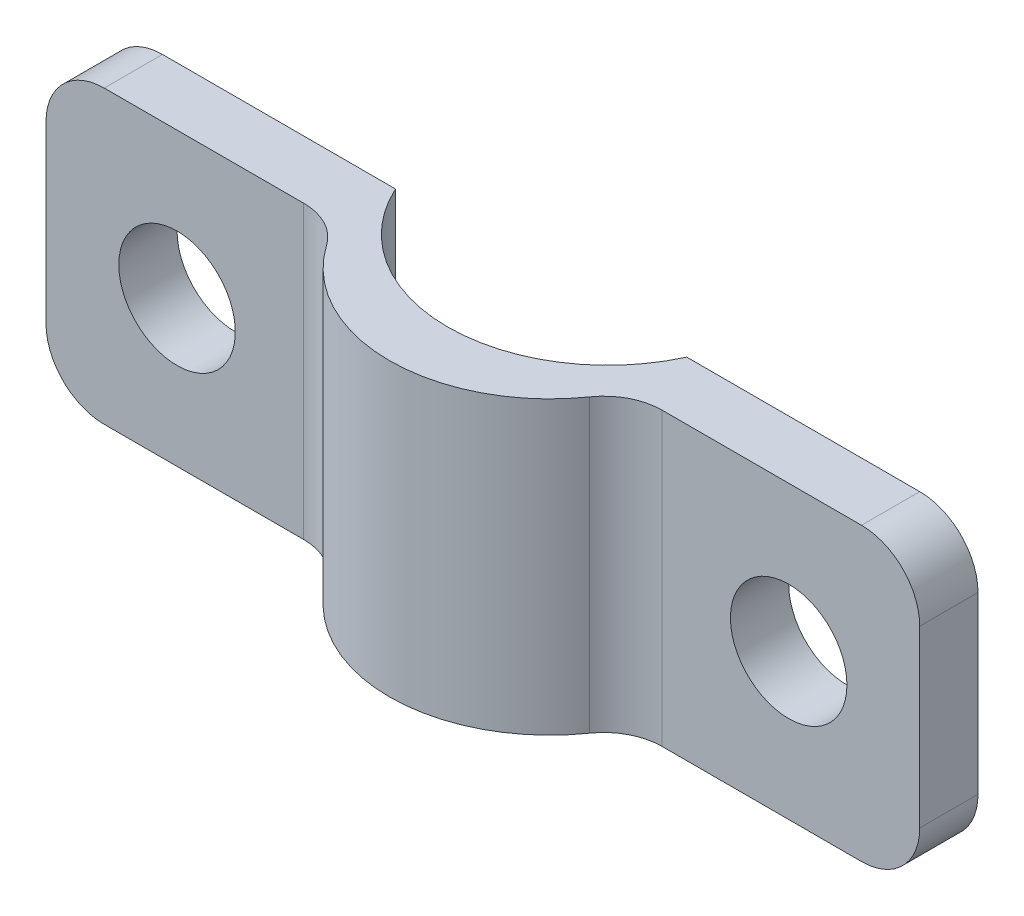
ISO-10303-21;
HEADER;
FILE_DESCRIPTION(('STEP AP214'),'2;1');
FILE_NAME('part.step','',(''),(''),'','','');
FILE_SCHEMA(('AUTOMOTIVE_DESIGN { 1 0 10303 214 1 1 1 1 }'));
ENDSEC;
DATA;
#1=APPLICATION_CONTEXT('core data for automotive mechanical design processes');
#2=APPLICATION_PROTOCOL_DEFINITION('international standard','automotive_design',2000,#1);
#3=PRODUCT_CONTEXT('',#1,'mechanical');
#4=PRODUCT('Part','Part','',(#3));
#5=PRODUCT_RELATED_PRODUCT_CATEGORY('part','',(#4));
#6=PRODUCT_DEFINITION_FORMATION('','',#4);
#7=PRODUCT_DEFINITION_CONTEXT('part definition',#1,'design');
#8=PRODUCT_DEFINITION('design','',#6,#7);
#9=PRODUCT_DEFINITION_SHAPE('','',#8);
#10=(LENGTH_UNIT() NAMED_UNIT(*) SI_UNIT(.MILLI.,.METRE.));
#11=(NAMED_UNIT(*) PLANE_ANGLE_UNIT() SI_UNIT($,.RADIAN.));
#12=(NAMED_UNIT(*) SI_UNIT($,.STERADIAN.) SOLID_ANGLE_UNIT());
#13=UNCERTAINTY_MEASURE_WITH_UNIT(LENGTH_MEASURE(1.E-05),#10,'distance_accuracy_value','');
#14=(GEOMETRIC_REPRESENTATION_CONTEXT(3) GLOBAL_UNCERTAINTY_ASSIGNED_CONTEXT((#13)) GLOBAL_UNIT_ASSIGNED_CONTEXT((#10,
#11,#12)) REPRESENTATION_CONTEXT('',''));
#15=CARTESIAN_POINT('',(0.,0.,0.));
#16=DIRECTION('',(0.,0.,1.));
#17=DIRECTION('',(1.,0.,0.));
#18=AXIS2_PLACEMENT_3D('',#15,#16,#17);
#19=CARTESIAN_POINT('',(0.,10.,2.));
#20=DIRECTION('',(0.,0.,-1.));
#21=DIRECTION('',(-1.,0.,0.));
#22=AXIS2_PLACEMENT_3D('',#19,#20,#21);
#23=PLANE('',#22);
#24=CARTESIAN_POINT('',(-10.5,5.,2.));
#25=DIRECTION('',(0.,0.,-1.));
#26=DIRECTION('',(-1.,0.,0.));
#27=AXIS2_PLACEMENT_3D('',#24,#25,#26);
#28=CIRCLE('',#27,2.);
#29=CARTESIAN_POINT('',(-12.5,5.,2.));
#30=VERTEX_POINT('',#29);
#31=EDGE_CURVE('E292',#30,#30,#28,.T.);
#32=ORIENTED_EDGE('',*,*,#31,.T.);
#33=EDGE_LOOP('',(#32));
#34=FACE_BOUND('',#33,.T.);
#35=DIRECTION('',(0.,-1.,0.));
#36=VECTOR('',#35,1.);
#37=CARTESIAN_POINT('',(-15.,10.,2.));
#38=LINE('',#37,#36);
#39=CARTESIAN_POINT('',(-15.,8.,2.));
#40=VERTEX_POINT('',#39);
#41=CARTESIAN_POINT('',(-15.,2.,2.));
#42=VERTEX_POINT('',#41);
#43=EDGE_CURVE('E178',#40,#42,#38,.T.);
#44=ORIENTED_EDGE('',*,*,#43,.T.);
#45=CARTESIAN_POINT('',(-13.,2.,2.));
#46=DIRECTION('',(0.,0.,-1.));
#47=DIRECTION('',(-1.,0.,0.));
#48=AXIS2_PLACEMENT_3D('',#45,#46,#47);
#49=CIRCLE('',#48,2.);
#50=CARTESIAN_POINT('',(-13.,0.,2.));
#51=VERTEX_POINT('',#50);
#52=EDGE_CURVE('E255',#42,#51,#49,.F.);
#53=ORIENTED_EDGE('',*,*,#52,.T.);
#54=DIRECTION('',(1.,0.,0.));
#55=VECTOR('',#54,1.);
#56=CARTESIAN_POINT('',(0.,0.,2.));
#57=LINE('',#56,#55);
#58=CARTESIAN_POINT('',(-6.15100387010838,0.,2.));
#59=VERTEX_POINT('',#58);
#60=EDGE_CURVE('E182',#51,#59,#57,.T.);
#61=ORIENTED_EDGE('',*,*,#60,.T.);
#62=DIRECTION('',(0.,1.,0.));
#63=VECTOR('',#62,1.);
#64=CARTESIAN_POINT('',(-6.15100387010838,10.,2.));
#65=LINE('',#64,#63);
#66=CARTESIAN_POINT('',(-6.15100387010838,10.,2.));
#67=VERTEX_POINT('',#66);
#68=EDGE_CURVE('E214',#59,#67,#65,.T.);
#69=ORIENTED_EDGE('',*,*,#68,.T.);
#70=DIRECTION('',(1.,0.,0.));
#71=VECTOR('',#70,1.);
#72=CARTESIAN_POINT('',(0.,10.,2.));
#73=LINE('',#72,#71);
#74=CARTESIAN_POINT('',(-13.,10.,2.));
#75=VERTEX_POINT('',#74);
#76=EDGE_CURVE('E195',#75,#67,#73,.T.);
#77=ORIENTED_EDGE('',*,*,#76,.F.);
#78=CARTESIAN_POINT('',(-13.,8.,2.));
#79=DIRECTION('',(0.,0.,-1.));
#80=DIRECTION('',(-1.,0.,0.));
#81=AXIS2_PLACEMENT_3D('',#78,#79,#80);
#82=CIRCLE('',#81,2.);
#83=EDGE_CURVE('E253',#75,#40,#82,.F.);
#84=ORIENTED_EDGE('',*,*,#83,.T.);
#85=EDGE_LOOP('',(#44,#53,#61,#69,#77,#84));
#86=FACE_BOUND('',#85,.T.);
#87=ADVANCED_FACE('F49',(#34,#86),#23,.F.);
#88=CARTESIAN_POINT('',(0.,10.,-0.291287847477918));
#89=DIRECTION('',(0.,-1.,0.));
#90=DIRECTION('',(0.,0.,-1.));
#91=AXIS2_PLACEMENT_3D('',#88,#89,#90);
#92=CYLINDRICAL_SURFACE('',#91,5.5);
#93=CARTESIAN_POINT('',(0.,0.,-0.291287847477918));
#94=DIRECTION('',(0.,1.,0.));
#95=DIRECTION('',(0.,0.,1.));
#96=AXIS2_PLACEMENT_3D('',#93,#94,#95);
#97=CIRCLE('',#96,5.5);
#98=CARTESIAN_POINT('',(-4.51073617141281,0.,2.85565657400589));
#99=VERTEX_POINT('',#98);
#100=CARTESIAN_POINT('',(4.51073617141282,0.,2.85565657400589));
#101=VERTEX_POINT('',#100);
#102=EDGE_CURVE('E184',#99,#101,#97,.T.);
#103=ORIENTED_EDGE('',*,*,#102,.T.);
#104=DIRECTION('',(0.,-1.,0.));
#105=VECTOR('',#104,1.);
#106=CARTESIAN_POINT('',(4.51073617141282,10.,2.85565657400589));
#107=LINE('',#106,#105);
#108=CARTESIAN_POINT('',(4.51073617141282,10.,2.85565657400589));
#109=VERTEX_POINT('',#108);
#110=EDGE_CURVE('E212',#101,#109,#107,.F.);
#111=ORIENTED_EDGE('',*,*,#110,.T.);
#112=CARTESIAN_POINT('',(0.,10.,-0.291287847477918));
#113=DIRECTION('',(0.,1.,0.));
#114=DIRECTION('',(0.,0.,1.));
#115=AXIS2_PLACEMENT_3D('',#112,#113,#114);
#116=CIRCLE('',#115,5.5);
#117=CARTESIAN_POINT('',(-4.51073617141281,10.,2.85565657400589));
#118=VERTEX_POINT('',#117);
#119=EDGE_CURVE('E279',#118,#109,#116,.T.);
#120=ORIENTED_EDGE('',*,*,#119,.F.);
#121=DIRECTION('',(0.,-1.,0.));
#122=VECTOR('',#121,1.);
#123=CARTESIAN_POINT('',(-4.51073617141282,10.,2.85565657400589));
#124=LINE('',#123,#122);
#125=EDGE_CURVE('E209',#118,#99,#124,.T.);
#126=ORIENTED_EDGE('',*,*,#125,.T.);
#127=EDGE_LOOP('',(#103,#111,#120,#126));
#128=FACE_BOUND('',#127,.T.);
#129=ADVANCED_FACE('F282',(#128),#92,.T.);
#130=CARTESIAN_POINT('',(0.,10.,2.));
#131=DIRECTION('',(0.,0.,1.));
#132=DIRECTION('',(1.,0.,0.));
#133=AXIS2_PLACEMENT_3D('',#130,#131,#132);
#134=PLANE('',#133);
#135=CARTESIAN_POINT('',(10.5,5.,2.));
#136=DIRECTION('',(0.,0.,1.));
#137=DIRECTION('',(1.,0.,0.));
#138=AXIS2_PLACEMENT_3D('',#135,#136,#137);
#139=CIRCLE('',#138,2.);
#140=CARTESIAN_POINT('',(12.5,5.,2.));
#141=VERTEX_POINT('',#140);
#142=EDGE_CURVE('E185',#141,#141,#139,.T.);
#143=ORIENTED_EDGE('',*,*,#142,.F.);
#144=EDGE_LOOP('',(#143));
#145=FACE_BOUND('',#144,.T.);
#146=DIRECTION('',(0.,-1.,0.));
#147=VECTOR('',#146,1.);
#148=CARTESIAN_POINT('',(15.,10.,2.));
#149=LINE('',#148,#147);
#150=CARTESIAN_POINT('',(15.,8.,2.));
#151=VERTEX_POINT('',#150);
#152=CARTESIAN_POINT('',(15.,2.,2.));
#153=VERTEX_POINT('',#152);
#154=EDGE_CURVE('E203',#151,#153,#149,.T.);
#155=ORIENTED_EDGE('',*,*,#154,.F.);
#156=CARTESIAN_POINT('',(13.,8.,2.));
#157=DIRECTION('',(0.,0.,1.));
#158=DIRECTION('',(1.,0.,0.));
#159=AXIS2_PLACEMENT_3D('',#156,#157,#158);
#160=CIRCLE('',#159,2.);
#161=CARTESIAN_POINT('',(13.,10.,2.));
#162=VERTEX_POINT('',#161);
#163=EDGE_CURVE('E234',#151,#162,#160,.T.);
#164=ORIENTED_EDGE('',*,*,#163,.T.);
#165=DIRECTION('',(-1.,0.,0.));
#166=VECTOR('',#165,1.);
#167=CARTESIAN_POINT('',(0.,10.,2.));
#168=LINE('',#167,#166);
#169=CARTESIAN_POINT('',(6.15100387010839,10.,2.));
#170=VERTEX_POINT('',#169);
#171=EDGE_CURVE('E172',#162,#170,#168,.T.);
#172=ORIENTED_EDGE('',*,*,#171,.T.);
#173=DIRECTION('',(0.,-1.,0.));
#174=VECTOR('',#173,1.);
#175=CARTESIAN_POINT('',(6.15100387010839,10.,2.));
#176=LINE('',#175,#174);
#177=CARTESIAN_POINT('',(6.15100387010839,0.,2.));
#178=VERTEX_POINT('',#177);
#179=EDGE_CURVE('E206',#170,#178,#176,.T.);
#180=ORIENTED_EDGE('',*,*,#179,.T.);
#181=DIRECTION('',(-1.,0.,0.));
#182=VECTOR('',#181,1.);
#183=CARTESIAN_POINT('',(0.,0.,2.));
#184=LINE('',#183,#182);
#185=CARTESIAN_POINT('',(13.,0.,2.));
#186=VERTEX_POINT('',#185);
#187=EDGE_CURVE('E188',#186,#178,#184,.T.);
#188=ORIENTED_EDGE('',*,*,#187,.F.);
#189=CARTESIAN_POINT('',(13.,2.,2.));
#190=DIRECTION('',(0.,0.,1.));
#191=DIRECTION('',(1.,0.,0.));
#192=AXIS2_PLACEMENT_3D('',#189,#190,#191);
#193=CIRCLE('',#192,2.);
#194=EDGE_CURVE('E232',#186,#153,#193,.T.);
#195=ORIENTED_EDGE('',*,*,#194,.T.);
#196=EDGE_LOOP('',(#155,#164,#172,#180,#188,#195));
#197=FACE_BOUND('',#196,.T.);
#198=ADVANCED_FACE('F320',(#145,#197),#134,.T.);
#199=CARTESIAN_POINT('',(15.,10.,0.));
#200=DIRECTION('',(1.,0.,0.));
#201=DIRECTION('',(0.,0.,-1.));
#202=AXIS2_PLACEMENT_3D('',#199,#200,#201);
#203=PLANE('',#202);
#204=DIRECTION('',(0.,-1.,0.));
#205=VECTOR('',#204,1.);
#206=CARTESIAN_POINT('',(15.,10.,0.));
#207=LINE('',#206,#205);
#208=CARTESIAN_POINT('',(15.,8.,0.));
#209=VERTEX_POINT('',#208);
#210=CARTESIAN_POINT('',(15.,2.,0.));
#211=VERTEX_POINT('',#210);
#212=EDGE_CURVE('E161',#209,#211,#207,.T.);
#213=ORIENTED_EDGE('',*,*,#212,.F.);
#214=DIRECTION('',(0.,0.,1.));
#215=VECTOR('',#214,1.);
#216=CARTESIAN_POINT('',(15.,8.,0.));
#217=LINE('',#216,#215);
#218=EDGE_CURVE('E229',#209,#151,#217,.T.);
#219=ORIENTED_EDGE('',*,*,#218,.T.);
#220=ORIENTED_EDGE('',*,*,#154,.T.);
#221=DIRECTION('',(0.,0.,1.));
#222=VECTOR('',#221,1.);
#223=CARTESIAN_POINT('',(15.,2.,0.));
#224=LINE('',#223,#222);
#225=EDGE_CURVE('E227',#153,#211,#224,.F.);
#226=ORIENTED_EDGE('',*,*,#225,.T.);
#227=EDGE_LOOP('',(#213,#219,#220,#226));
#228=FACE_BOUND('',#227,.T.);
#229=ADVANCED_FACE('F428',(#228),#203,.T.);
#230=CARTESIAN_POINT('',(0.,10.,0.));
#231=DIRECTION('',(0.,0.,-1.));
#232=DIRECTION('',(-1.,0.,0.));
#233=AXIS2_PLACEMENT_3D('',#230,#231,#232);
#234=PLANE('',#233);
#235=CARTESIAN_POINT('',(10.5,5.,0.));
#236=DIRECTION('',(0.,0.,-1.));
#237=DIRECTION('',(-1.,0.,0.));
#238=AXIS2_PLACEMENT_3D('',#235,#236,#237);
#239=CIRCLE('',#238,2.);
#240=CARTESIAN_POINT('',(8.5,5.,0.));
#241=VERTEX_POINT('',#240);
#242=EDGE_CURVE('E289',#241,#241,#239,.T.);
#243=ORIENTED_EDGE('',*,*,#242,.F.);
#244=EDGE_LOOP('',(#243));
#245=FACE_BOUND('',#244,.T.);
#246=DIRECTION('',(1.,0.,0.));
#247=VECTOR('',#246,1.);
#248=CARTESIAN_POINT('',(0.,10.,0.));
#249=LINE('',#248,#247);
#250=CARTESIAN_POINT('',(5.,10.,0.));
#251=VERTEX_POINT('',#250);
#252=CARTESIAN_POINT('',(13.,10.,0.));
#253=VERTEX_POINT('',#252);
#254=EDGE_CURVE('E153',#251,#253,#249,.T.);
#255=ORIENTED_EDGE('',*,*,#254,.T.);
#256=CARTESIAN_POINT('',(13.,8.,0.));
#257=DIRECTION('',(0.,0.,-1.));
#258=DIRECTION('',(-1.,0.,0.));
#259=AXIS2_PLACEMENT_3D('',#256,#257,#258);
#260=CIRCLE('',#259,2.);
#261=EDGE_CURVE('E242',#253,#209,#260,.T.);
#262=ORIENTED_EDGE('',*,*,#261,.T.);
#263=ORIENTED_EDGE('',*,*,#212,.T.);
#264=CARTESIAN_POINT('',(13.,2.,0.));
#265=DIRECTION('',(0.,0.,-1.));
#266=DIRECTION('',(-1.,0.,0.));
#267=AXIS2_PLACEMENT_3D('',#264,#265,#266);
#268=CIRCLE('',#267,2.);
#269=CARTESIAN_POINT('',(13.,0.,0.));
#270=VERTEX_POINT('',#269);
#271=EDGE_CURVE('E240',#211,#270,#268,.T.);
#272=ORIENTED_EDGE('',*,*,#271,.T.);
#273=DIRECTION('',(1.,0.,0.));
#274=VECTOR('',#273,1.);
#275=CARTESIAN_POINT('',(0.,0.,0.));
#276=LINE('',#275,#274);
#277=CARTESIAN_POINT('',(5.,0.,0.));
#278=VERTEX_POINT('',#277);
#279=EDGE_CURVE('E156',#278,#270,#276,.T.);
#280=ORIENTED_EDGE('',*,*,#279,.F.);
#281=DIRECTION('',(0.,-1.,0.));
#282=VECTOR('',#281,1.);
#283=CARTESIAN_POINT('',(5.,10.,0.));
#284=LINE('',#283,#282);
#285=EDGE_CURVE('E150',#251,#278,#284,.T.);
#286=ORIENTED_EDGE('',*,*,#285,.F.);
#287=EDGE_LOOP('',(#255,#262,#263,#272,#280,#286));
#288=FACE_BOUND('',#287,.T.);
#289=ADVANCED_FACE('F152',(#245,#288),#234,.T.);
#290=CARTESIAN_POINT('',(0.,10.,-2.29128784747792));
#291=DIRECTION('',(0.,-1.,0.));
#292=DIRECTION('',(0.,0.,-1.));
#293=AXIS2_PLACEMENT_3D('',#290,#291,#292);
#294=CYLINDRICAL_SURFACE('',#293,5.5);
#295=CARTESIAN_POINT('',(0.,0.,-2.29128784747792));
#296=DIRECTION('',(0.,1.,0.));
#297=DIRECTION('',(0.,0.,1.));
#298=AXIS2_PLACEMENT_3D('',#295,#296,#297);
#299=CIRCLE('',#298,5.5);
#300=CARTESIAN_POINT('',(-5.,0.,0.));
#301=VERTEX_POINT('',#300);
#302=EDGE_CURVE('E191',#301,#278,#299,.T.);
#303=ORIENTED_EDGE('',*,*,#302,.F.);
#304=DIRECTION('',(0.,-1.,0.));
#305=VECTOR('',#304,1.);
#306=CARTESIAN_POINT('',(-5.,10.,0.));
#307=LINE('',#306,#305);
#308=CARTESIAN_POINT('',(-5.,10.,0.));
#309=VERTEX_POINT('',#308);
#310=EDGE_CURVE('E162',#309,#301,#307,.T.);
#311=ORIENTED_EDGE('',*,*,#310,.F.);
#312=CARTESIAN_POINT('',(0.,10.,-2.29128784747792));
#313=DIRECTION('',(0.,1.,0.));
#314=DIRECTION('',(0.,0.,1.));
#315=AXIS2_PLACEMENT_3D('',#312,#313,#314);
#316=CIRCLE('',#315,5.5);
#317=EDGE_CURVE('E169',#309,#251,#316,.T.);
#318=ORIENTED_EDGE('',*,*,#317,.T.);
#319=ORIENTED_EDGE('',*,*,#285,.T.);
#320=EDGE_LOOP('',(#303,#311,#318,#319));
#321=FACE_BOUND('',#320,.T.);
#322=ADVANCED_FACE('F174',(#321),#294,.F.);
#323=CARTESIAN_POINT('',(0.,10.,0.));
#324=DIRECTION('',(0.,0.,1.));
#325=DIRECTION('',(1.,0.,0.));
#326=AXIS2_PLACEMENT_3D('',#323,#324,#325);
#327=PLANE('',#326);
#328=CARTESIAN_POINT('',(-10.5,5.,0.));
#329=DIRECTION('',(0.,0.,-1.));
#330=DIRECTION('',(-1.,0.,0.));
#331=AXIS2_PLACEMENT_3D('',#328,#329,#330);
#332=CIRCLE('',#331,2.);
#333=CARTESIAN_POINT('',(-12.5,5.,0.));
#334=VERTEX_POINT('',#333);
#335=EDGE_CURVE('E295',#334,#334,#332,.T.);
#336=ORIENTED_EDGE('',*,*,#335,.F.);
#337=EDGE_LOOP('',(#336));
#338=FACE_BOUND('',#337,.T.);
#339=DIRECTION('',(-1.,0.,0.));
#340=VECTOR('',#339,1.);
#341=CARTESIAN_POINT('',(0.,0.,0.));
#342=LINE('',#341,#340);
#343=CARTESIAN_POINT('',(-13.,0.,0.));
#344=VERTEX_POINT('',#343);
#345=EDGE_CURVE('E193',#301,#344,#342,.T.);
#346=ORIENTED_EDGE('',*,*,#345,.T.);
#347=CARTESIAN_POINT('',(-13.,2.,0.));
#348=DIRECTION('',(0.,0.,1.));
#349=DIRECTION('',(1.,0.,0.));
#350=AXIS2_PLACEMENT_3D('',#347,#348,#349);
#351=CIRCLE('',#350,2.);
#352=CARTESIAN_POINT('',(-15.,2.,0.));
#353=VERTEX_POINT('',#352);
#354=EDGE_CURVE('E11',#344,#353,#351,.F.);
#355=ORIENTED_EDGE('',*,*,#354,.T.);
#356=DIRECTION('',(0.,-1.,0.));
#357=VECTOR('',#356,1.);
#358=CARTESIAN_POINT('',(-15.,10.,0.));
#359=LINE('',#358,#357);
#360=CARTESIAN_POINT('',(-15.,8.,0.));
#361=VERTEX_POINT('',#360);
#362=EDGE_CURVE('E198',#361,#353,#359,.T.);
#363=ORIENTED_EDGE('',*,*,#362,.F.);
#364=CARTESIAN_POINT('',(-13.,8.,0.));
#365=DIRECTION('',(0.,0.,1.));
#366=DIRECTION('',(1.,0.,0.));
#367=AXIS2_PLACEMENT_3D('',#364,#365,#366);
#368=CIRCLE('',#367,2.);
#369=CARTESIAN_POINT('',(-13.,10.,0.));
#370=VERTEX_POINT('',#369);
#371=EDGE_CURVE('E57',#361,#370,#368,.F.);
#372=ORIENTED_EDGE('',*,*,#371,.T.);
#373=DIRECTION('',(-1.,0.,0.));
#374=VECTOR('',#373,1.);
#375=CARTESIAN_POINT('',(0.,10.,0.));
#376=LINE('',#375,#374);
#377=EDGE_CURVE('E176',#309,#370,#376,.T.);
#378=ORIENTED_EDGE('',*,*,#377,.F.);
#379=ORIENTED_EDGE('',*,*,#310,.T.);
#380=EDGE_LOOP('',(#346,#355,#363,#372,#378,#379));
#381=FACE_BOUND('',#380,.T.);
#382=ADVANCED_FACE('F257',(#338,#381),#327,.F.);
#383=CARTESIAN_POINT('',(-15.,10.,0.));
#384=DIRECTION('',(1.,0.,0.));
#385=DIRECTION('',(0.,0.,-1.));
#386=AXIS2_PLACEMENT_3D('',#383,#384,#385);
#387=PLANE('',#386);
#388=ORIENTED_EDGE('',*,*,#362,.T.);
#389=DIRECTION('',(0.,0.,1.));
#390=VECTOR('',#389,1.);
#391=CARTESIAN_POINT('',(-15.,2.,0.));
#392=LINE('',#391,#390);
#393=EDGE_CURVE('E250',#353,#42,#392,.T.);
#394=ORIENTED_EDGE('',*,*,#393,.T.);
#395=ORIENTED_EDGE('',*,*,#43,.F.);
#396=DIRECTION('',(0.,0.,1.));
#397=VECTOR('',#396,1.);
#398=CARTESIAN_POINT('',(-15.,8.,0.));
#399=LINE('',#398,#397);
#400=EDGE_CURVE('E69',#40,#361,#399,.F.);
#401=ORIENTED_EDGE('',*,*,#400,.T.);
#402=EDGE_LOOP('',(#388,#394,#395,#401));
#403=FACE_BOUND('',#402,.T.);
#404=ADVANCED_FACE('F262',(#403),#387,.F.);
#405=CARTESIAN_POINT('',(0.,10.,0.));
#406=DIRECTION('',(0.,1.,0.));
#407=DIRECTION('',(0.,0.,1.));
#408=AXIS2_PLACEMENT_3D('',#405,#406,#407);
#409=PLANE('',#408);
#410=ORIENTED_EDGE('',*,*,#171,.F.);
#411=DIRECTION('',(0.,0.,1.));
#412=VECTOR('',#411,1.);
#413=CARTESIAN_POINT('',(13.,10.,0.));
#414=LINE('',#413,#412);
#415=EDGE_CURVE('E171',#162,#253,#414,.F.);
#416=ORIENTED_EDGE('',*,*,#415,.T.);
#417=ORIENTED_EDGE('',*,*,#254,.F.);
#418=ORIENTED_EDGE('',*,*,#317,.F.);
#419=ORIENTED_EDGE('',*,*,#377,.T.);
#420=DIRECTION('',(0.,0.,1.));
#421=VECTOR('',#420,1.);
#422=CARTESIAN_POINT('',(-13.,10.,2.));
#423=LINE('',#422,#421);
#424=EDGE_CURVE('E236',#370,#75,#423,.T.);
#425=ORIENTED_EDGE('',*,*,#424,.T.);
#426=ORIENTED_EDGE('',*,*,#76,.T.);
#427=CARTESIAN_POINT('',(-6.15100387010838,10.,4.));
#428=DIRECTION('',(0.,1.,0.));
#429=DIRECTION('',(0.,0.,1.));
#430=AXIS2_PLACEMENT_3D('',#427,#428,#429);
#431=CIRCLE('',#430,2.);
#432=EDGE_CURVE('E225',#67,#118,#431,.F.);
#433=ORIENTED_EDGE('',*,*,#432,.T.);
#434=ORIENTED_EDGE('',*,*,#119,.T.);
#435=CARTESIAN_POINT('',(6.15100387010839,10.,4.));
#436=DIRECTION('',(0.,1.,0.));
#437=DIRECTION('',(0.,0.,1.));
#438=AXIS2_PLACEMENT_3D('',#435,#436,#437);
#439=CIRCLE('',#438,2.);
#440=EDGE_CURVE('E219',#109,#170,#439,.F.);
#441=ORIENTED_EDGE('',*,*,#440,.T.);
#442=EDGE_LOOP('',(#410,#416,#417,#418,#419,#425,#426,#433,#434,#441));
#443=FACE_BOUND('',#442,.T.);
#444=ADVANCED_FACE('F167',(#443),#409,.T.);
#445=CARTESIAN_POINT('',(0.,0.,0.));
#446=DIRECTION('',(0.,1.,0.));
#447=DIRECTION('',(0.,0.,1.));
#448=AXIS2_PLACEMENT_3D('',#445,#446,#447);
#449=PLANE('',#448);
#450=ORIENTED_EDGE('',*,*,#279,.T.);
#451=DIRECTION('',(0.,0.,1.));
#452=VECTOR('',#451,1.);
#453=CARTESIAN_POINT('',(13.,0.,2.));
#454=LINE('',#453,#452);
#455=EDGE_CURVE('E246',#270,#186,#454,.T.);
#456=ORIENTED_EDGE('',*,*,#455,.T.);
#457=ORIENTED_EDGE('',*,*,#187,.T.);
#458=CARTESIAN_POINT('',(6.15100387010839,0.,4.));
#459=DIRECTION('',(0.,1.,0.));
#460=DIRECTION('',(0.,0.,1.));
#461=AXIS2_PLACEMENT_3D('',#458,#459,#460);
#462=CIRCLE('',#461,2.);
#463=EDGE_CURVE('E217',#178,#101,#462,.T.);
#464=ORIENTED_EDGE('',*,*,#463,.T.);
#465=ORIENTED_EDGE('',*,*,#102,.F.);
#466=CARTESIAN_POINT('',(-6.15100387010838,0.,4.));
#467=DIRECTION('',(0.,1.,0.));
#468=DIRECTION('',(0.,0.,1.));
#469=AXIS2_PLACEMENT_3D('',#466,#467,#468);
#470=CIRCLE('',#469,2.);
#471=EDGE_CURVE('E222',#99,#59,#470,.T.);
#472=ORIENTED_EDGE('',*,*,#471,.T.);
#473=ORIENTED_EDGE('',*,*,#60,.F.);
#474=DIRECTION('',(0.,0.,1.));
#475=VECTOR('',#474,1.);
#476=CARTESIAN_POINT('',(-13.,0.,0.));
#477=LINE('',#476,#475);
#478=EDGE_CURVE('E244',#51,#344,#477,.F.);
#479=ORIENTED_EDGE('',*,*,#478,.T.);
#480=ORIENTED_EDGE('',*,*,#345,.F.);
#481=ORIENTED_EDGE('',*,*,#302,.T.);
#482=EDGE_LOOP('',(#450,#456,#457,#464,#465,#472,#473,#479,#480,#481));
#483=FACE_BOUND('',#482,.T.);
#484=ADVANCED_FACE('F269',(#483),#449,.F.);
#485=CARTESIAN_POINT('',(6.15100387010839,10.,4.));
#486=DIRECTION('',(0.,-1.,0.));
#487=DIRECTION('',(0.,0.,-1.));
#488=AXIS2_PLACEMENT_3D('',#485,#486,#487);
#489=CYLINDRICAL_SURFACE('',#488,2.);
#490=ORIENTED_EDGE('',*,*,#440,.F.);
#491=ORIENTED_EDGE('',*,*,#110,.F.);
#492=ORIENTED_EDGE('',*,*,#463,.F.);
#493=ORIENTED_EDGE('',*,*,#179,.F.);
#494=EDGE_LOOP('',(#490,#491,#492,#493));
#495=FACE_BOUND('',#494,.T.);
#496=ADVANCED_FACE('F324',(#495),#489,.F.);
#497=CARTESIAN_POINT('',(-6.15100387010838,10.,4.));
#498=DIRECTION('',(0.,-1.,0.));
#499=DIRECTION('',(0.,0.,-1.));
#500=AXIS2_PLACEMENT_3D('',#497,#498,#499);
#501=CYLINDRICAL_SURFACE('',#500,2.);
#502=ORIENTED_EDGE('',*,*,#432,.F.);
#503=ORIENTED_EDGE('',*,*,#68,.F.);
#504=ORIENTED_EDGE('',*,*,#471,.F.);
#505=ORIENTED_EDGE('',*,*,#125,.F.);
#506=EDGE_LOOP('',(#502,#503,#504,#505));
#507=FACE_BOUND('',#506,.T.);
#508=ADVANCED_FACE('F276',(#507),#501,.F.);
#509=CARTESIAN_POINT('',(13.,8.,0.));
#510=DIRECTION('',(0.,0.,1.));
#511=DIRECTION('',(1.,0.,0.));
#512=AXIS2_PLACEMENT_3D('',#509,#510,#511);
#513=CYLINDRICAL_SURFACE('',#512,2.);
#514=ORIENTED_EDGE('',*,*,#261,.F.);
#515=ORIENTED_EDGE('',*,*,#415,.F.);
#516=ORIENTED_EDGE('',*,*,#163,.F.);
#517=ORIENTED_EDGE('',*,*,#218,.F.);
#518=EDGE_LOOP('',(#514,#515,#516,#517));
#519=FACE_BOUND('',#518,.T.);
#520=ADVANCED_FACE('F330',(#519),#513,.T.);
#521=CARTESIAN_POINT('',(13.,2.,0.));
#522=DIRECTION('',(0.,0.,-1.));
#523=DIRECTION('',(-1.,0.,0.));
#524=AXIS2_PLACEMENT_3D('',#521,#522,#523);
#525=CYLINDRICAL_SURFACE('',#524,2.);
#526=ORIENTED_EDGE('',*,*,#271,.F.);
#527=ORIENTED_EDGE('',*,*,#225,.F.);
#528=ORIENTED_EDGE('',*,*,#194,.F.);
#529=ORIENTED_EDGE('',*,*,#455,.F.);
#530=EDGE_LOOP('',(#526,#527,#528,#529));
#531=FACE_BOUND('',#530,.T.);
#532=ADVANCED_FACE('F333',(#531),#525,.T.);
#533=CARTESIAN_POINT('',(-13.,2.,0.));
#534=DIRECTION('',(0.,0.,1.));
#535=DIRECTION('',(1.,0.,0.));
#536=AXIS2_PLACEMENT_3D('',#533,#534,#535);
#537=CYLINDRICAL_SURFACE('',#536,2.);
#538=ORIENTED_EDGE('',*,*,#354,.F.);
#539=ORIENTED_EDGE('',*,*,#478,.F.);
#540=ORIENTED_EDGE('',*,*,#52,.F.);
#541=ORIENTED_EDGE('',*,*,#393,.F.);
#542=EDGE_LOOP('',(#538,#539,#540,#541));
#543=FACE_BOUND('',#542,.T.);
#544=ADVANCED_FACE('F265',(#543),#537,.T.);
#545=CARTESIAN_POINT('',(-13.,8.,0.));
#546=DIRECTION('',(0.,0.,-1.));
#547=DIRECTION('',(-1.,0.,0.));
#548=AXIS2_PLACEMENT_3D('',#545,#546,#547);
#549=CYLINDRICAL_SURFACE('',#548,2.);
#550=ORIENTED_EDGE('',*,*,#371,.F.);
#551=ORIENTED_EDGE('',*,*,#400,.F.);
#552=ORIENTED_EDGE('',*,*,#83,.F.);
#553=ORIENTED_EDGE('',*,*,#424,.F.);
#554=EDGE_LOOP('',(#550,#551,#552,#553));
#555=FACE_BOUND('',#554,.T.);
#556=ADVANCED_FACE('F51',(#555),#549,.T.);
#557=CARTESIAN_POINT('',(10.5,5.,0.));
#558=DIRECTION('',(0.,0.,-1.));
#559=DIRECTION('',(-1.,0.,0.));
#560=AXIS2_PLACEMENT_3D('',#557,#558,#559);
#561=CYLINDRICAL_SURFACE('',#560,2.);
#562=ORIENTED_EDGE('',*,*,#142,.T.);
#563=EDGE_LOOP('',(#562));
#564=FACE_BOUND('',#563,.T.);
#565=ORIENTED_EDGE('',*,*,#242,.T.);
#566=EDGE_LOOP('',(#565));
#567=FACE_BOUND('',#566,.T.);
#568=ADVANCED_FACE('F340',(#564,#567),#561,.F.);
#569=CARTESIAN_POINT('',(-10.5,5.,0.));
#570=DIRECTION('',(0.,0.,-1.));
#571=DIRECTION('',(-1.,0.,0.));
#572=AXIS2_PLACEMENT_3D('',#569,#570,#571);
#573=CYLINDRICAL_SURFACE('',#572,2.);
#574=ORIENTED_EDGE('',*,*,#335,.T.);
#575=EDGE_LOOP('',(#574));
#576=FACE_BOUND('',#575,.T.);
#577=ORIENTED_EDGE('',*,*,#31,.F.);
#578=EDGE_LOOP('',(#577));
#579=FACE_BOUND('',#578,.T.);
#580=ADVANCED_FACE('F299',(#576,#579),#573,.F.);
#581=CLOSED_SHELL('',(#87,#129,#198,#229,#289,#322,#382,#404,#444,#484,#496,#508,#520,#532,#544,
#556,#568,#580));
#582=MANIFOLD_SOLID_BREP('B2',#581);
#583=ADVANCED_BREP_SHAPE_REPRESENTATION('',(#18,#582),#14);
#584=SHAPE_DEFINITION_REPRESENTATION(#9,#583);
ENDSEC;
END-ISO-10303-21;
